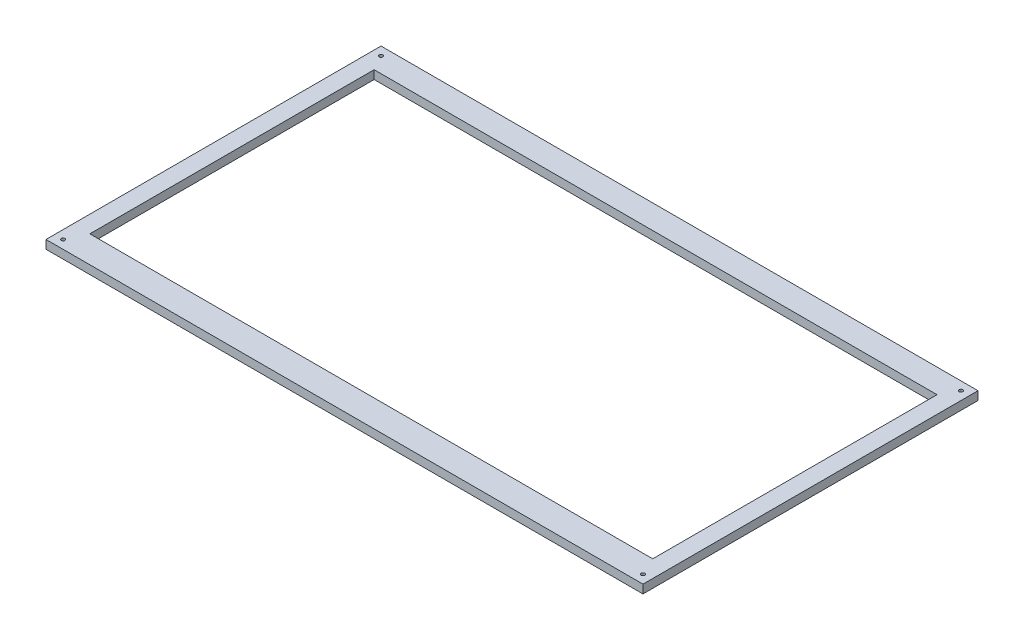
ISO-10303-21;
HEADER;
FILE_DESCRIPTION(('STEP AP214'),'2;1');
FILE_NAME('part.step','',(''),(''),'','','');
FILE_SCHEMA(('AUTOMOTIVE_DESIGN { 1 0 10303 214 1 1 1 1 }'));
ENDSEC;
DATA;
#1=APPLICATION_CONTEXT('core data for automotive mechanical design processes');
#2=APPLICATION_PROTOCOL_DEFINITION('international standard','automotive_design',2000,#1);
#3=PRODUCT_CONTEXT('',#1,'mechanical');
#4=PRODUCT('Part','Part','',(#3));
#5=PRODUCT_RELATED_PRODUCT_CATEGORY('part','',(#4));
#6=PRODUCT_DEFINITION_FORMATION('','',#4);
#7=PRODUCT_DEFINITION_CONTEXT('part definition',#1,'design');
#8=PRODUCT_DEFINITION('design','',#6,#7);
#9=PRODUCT_DEFINITION_SHAPE('','',#8);
#10=(LENGTH_UNIT() NAMED_UNIT(*) SI_UNIT(.MILLI.,.METRE.));
#11=(NAMED_UNIT(*) PLANE_ANGLE_UNIT() SI_UNIT($,.RADIAN.));
#12=(NAMED_UNIT(*) SI_UNIT($,.STERADIAN.) SOLID_ANGLE_UNIT());
#13=UNCERTAINTY_MEASURE_WITH_UNIT(LENGTH_MEASURE(1.E-05),#10,'distance_accuracy_value','');
#14=(GEOMETRIC_REPRESENTATION_CONTEXT(3) GLOBAL_UNCERTAINTY_ASSIGNED_CONTEXT((#13)) GLOBAL_UNIT_ASSIGNED_CONTEXT((#10,
#11,#12)) REPRESENTATION_CONTEXT('',''));
#15=CARTESIAN_POINT('',(0.,0.,0.));
#16=DIRECTION('',(0.,0.,1.));
#17=DIRECTION('',(1.,0.,0.));
#18=AXIS2_PLACEMENT_3D('',#15,#16,#17);
#19=CARTESIAN_POINT('',(-1050.,-30.,-589.25));
#20=DIRECTION('',(-1.,0.,0.));
#21=DIRECTION('',(0.,0.,1.));
#22=AXIS2_PLACEMENT_3D('',#19,#20,#21);
#23=PLANE('',#22);
#24=DIRECTION('',(0.,0.,1.));
#25=VECTOR('',#24,1.);
#26=CARTESIAN_POINT('',(-1050.,0.,-589.25));
#27=LINE('',#26,#25);
#28=CARTESIAN_POINT('',(-1050.,0.,-589.25));
#29=VERTEX_POINT('',#28);
#30=CARTESIAN_POINT('',(-1050.,0.,589.25));
#31=VERTEX_POINT('',#30);
#32=EDGE_CURVE('E136',#29,#31,#27,.T.);
#33=ORIENTED_EDGE('',*,*,#32,.F.);
#34=DIRECTION('',(0.,1.,0.));
#35=VECTOR('',#34,1.);
#36=CARTESIAN_POINT('',(-1050.,-30.,-589.25));
#37=LINE('',#36,#35);
#38=CARTESIAN_POINT('',(-1050.,-30.,-589.25));
#39=VERTEX_POINT('',#38);
#40=EDGE_CURVE('E11',#39,#29,#37,.T.);
#41=ORIENTED_EDGE('',*,*,#40,.F.);
#42=DIRECTION('',(0.,0.,1.));
#43=VECTOR('',#42,1.);
#44=CARTESIAN_POINT('',(-1050.,-30.,-589.25));
#45=LINE('',#44,#43);
#46=CARTESIAN_POINT('',(-1050.,-30.,589.25));
#47=VERTEX_POINT('',#46);
#48=EDGE_CURVE('E140',#39,#47,#45,.T.);
#49=ORIENTED_EDGE('',*,*,#48,.T.);
#50=DIRECTION('',(0.,1.,0.));
#51=VECTOR('',#50,1.);
#52=CARTESIAN_POINT('',(-1050.,-30.,589.25));
#53=LINE('',#52,#51);
#54=EDGE_CURVE('E37',#47,#31,#53,.T.);
#55=ORIENTED_EDGE('',*,*,#54,.T.);
#56=EDGE_LOOP('',(#33,#41,#49,#55));
#57=FACE_BOUND('',#56,.T.);
#58=ADVANCED_FACE('F34',(#57),#23,.T.);
#59=CARTESIAN_POINT('',(-1050.,-30.,-589.25));
#60=DIRECTION('',(0.,0.,-1.));
#61=DIRECTION('',(-1.,0.,0.));
#62=AXIS2_PLACEMENT_3D('',#59,#60,#61);
#63=PLANE('',#62);
#64=DIRECTION('',(-1.,0.,0.));
#65=VECTOR('',#64,1.);
#66=CARTESIAN_POINT('',(-1050.,0.,-589.25));
#67=LINE('',#66,#65);
#68=CARTESIAN_POINT('',(1050.,0.,-589.25));
#69=VERTEX_POINT('',#68);
#70=EDGE_CURVE('E144',#69,#29,#67,.T.);
#71=ORIENTED_EDGE('',*,*,#70,.F.);
#72=DIRECTION('',(0.,1.,0.));
#73=VECTOR('',#72,1.);
#74=CARTESIAN_POINT('',(1050.,-30.,-589.25));
#75=LINE('',#74,#73);
#76=CARTESIAN_POINT('',(1050.,-30.,-589.25));
#77=VERTEX_POINT('',#76);
#78=EDGE_CURVE('E42',#77,#69,#75,.T.);
#79=ORIENTED_EDGE('',*,*,#78,.F.);
#80=DIRECTION('',(-1.,0.,0.));
#81=VECTOR('',#80,1.);
#82=CARTESIAN_POINT('',(-1050.,-30.,-589.25));
#83=LINE('',#82,#81);
#84=EDGE_CURVE('E150',#77,#39,#83,.T.);
#85=ORIENTED_EDGE('',*,*,#84,.T.);
#86=ORIENTED_EDGE('',*,*,#40,.T.);
#87=EDGE_LOOP('',(#71,#79,#85,#86));
#88=FACE_BOUND('',#87,.T.);
#89=ADVANCED_FACE('F176',(#88),#63,.T.);
#90=CARTESIAN_POINT('',(1050.,-30.,-589.25));
#91=DIRECTION('',(1.,0.,0.));
#92=DIRECTION('',(0.,0.,-1.));
#93=AXIS2_PLACEMENT_3D('',#90,#91,#92);
#94=PLANE('',#93);
#95=DIRECTION('',(0.,0.,-1.));
#96=VECTOR('',#95,1.);
#97=CARTESIAN_POINT('',(1050.,0.,-589.25));
#98=LINE('',#97,#96);
#99=CARTESIAN_POINT('',(1050.,0.,589.25));
#100=VERTEX_POINT('',#99);
#101=EDGE_CURVE('E158',#100,#69,#98,.T.);
#102=ORIENTED_EDGE('',*,*,#101,.F.);
#103=DIRECTION('',(0.,1.,0.));
#104=VECTOR('',#103,1.);
#105=CARTESIAN_POINT('',(1050.,-30.,589.25));
#106=LINE('',#105,#104);
#107=CARTESIAN_POINT('',(1050.,-30.,589.25));
#108=VERTEX_POINT('',#107);
#109=EDGE_CURVE('E163',#108,#100,#106,.T.);
#110=ORIENTED_EDGE('',*,*,#109,.F.);
#111=DIRECTION('',(0.,0.,-1.));
#112=VECTOR('',#111,1.);
#113=CARTESIAN_POINT('',(1050.,-30.,-589.25));
#114=LINE('',#113,#112);
#115=EDGE_CURVE('E147',#108,#77,#114,.T.);
#116=ORIENTED_EDGE('',*,*,#115,.T.);
#117=ORIENTED_EDGE('',*,*,#78,.T.);
#118=EDGE_LOOP('',(#102,#110,#116,#117));
#119=FACE_BOUND('',#118,.T.);
#120=ADVANCED_FACE('F180',(#119),#94,.T.);
#121=CARTESIAN_POINT('',(-1050.,-30.,589.25));
#122=DIRECTION('',(0.,0.,1.));
#123=DIRECTION('',(1.,0.,0.));
#124=AXIS2_PLACEMENT_3D('',#121,#122,#123);
#125=PLANE('',#124);
#126=DIRECTION('',(1.,0.,0.));
#127=VECTOR('',#126,1.);
#128=CARTESIAN_POINT('',(-1050.,0.,589.25));
#129=LINE('',#128,#127);
#130=EDGE_CURVE('E155',#31,#100,#129,.T.);
#131=ORIENTED_EDGE('',*,*,#130,.F.);
#132=ORIENTED_EDGE('',*,*,#54,.F.);
#133=DIRECTION('',(1.,0.,0.));
#134=VECTOR('',#133,1.);
#135=CARTESIAN_POINT('',(-1050.,-30.,589.25));
#136=LINE('',#135,#134);
#137=EDGE_CURVE('E143',#47,#108,#136,.T.);
#138=ORIENTED_EDGE('',*,*,#137,.T.);
#139=ORIENTED_EDGE('',*,*,#109,.T.);
#140=EDGE_LOOP('',(#131,#132,#138,#139));
#141=FACE_BOUND('',#140,.T.);
#142=ADVANCED_FACE('F171',(#141),#125,.T.);
#143=CARTESIAN_POINT('',(0.,-30.,0.));
#144=DIRECTION('',(0.,1.,0.));
#145=DIRECTION('',(0.,0.,1.));
#146=AXIS2_PLACEMENT_3D('',#143,#144,#145);
#147=PLANE('',#146);
#148=CARTESIAN_POINT('',(-1020.,-30.,559.25));
#149=DIRECTION('',(0.,1.,0.));
#150=DIRECTION('',(0.,0.,1.));
#151=AXIS2_PLACEMENT_3D('',#148,#149,#150);
#152=CIRCLE('',#151,6.35000000000015);
#153=CARTESIAN_POINT('',(-1020.,-30.,565.6));
#154=VERTEX_POINT('',#153);
#155=EDGE_CURVE('E305',#154,#154,#152,.T.);
#156=ORIENTED_EDGE('',*,*,#155,.T.);
#157=EDGE_LOOP('',(#156));
#158=FACE_BOUND('',#157,.T.);
#159=CARTESIAN_POINT('',(1020.,-30.,-559.25));
#160=DIRECTION('',(0.,1.,0.));
#161=DIRECTION('',(0.,0.,1.));
#162=AXIS2_PLACEMENT_3D('',#159,#160,#161);
#163=CIRCLE('',#162,6.35000000000015);
#164=CARTESIAN_POINT('',(1020.,-30.,-552.9));
#165=VERTEX_POINT('',#164);
#166=EDGE_CURVE('E309',#165,#165,#163,.T.);
#167=ORIENTED_EDGE('',*,*,#166,.T.);
#168=EDGE_LOOP('',(#167));
#169=FACE_BOUND('',#168,.T.);
#170=CARTESIAN_POINT('',(1020.,-30.,559.25));
#171=DIRECTION('',(0.,1.,0.));
#172=DIRECTION('',(0.,0.,1.));
#173=AXIS2_PLACEMENT_3D('',#170,#171,#172);
#174=CIRCLE('',#173,6.35000000000015);
#175=CARTESIAN_POINT('',(1020.,-30.,565.6));
#176=VERTEX_POINT('',#175);
#177=EDGE_CURVE('E318',#176,#176,#174,.T.);
#178=ORIENTED_EDGE('',*,*,#177,.T.);
#179=EDGE_LOOP('',(#178));
#180=FACE_BOUND('',#179,.T.);
#181=CARTESIAN_POINT('',(-1020.,-30.,-559.25));
#182=DIRECTION('',(0.,1.,0.));
#183=DIRECTION('',(0.,0.,1.));
#184=AXIS2_PLACEMENT_3D('',#181,#182,#183);
#185=CIRCLE('',#184,6.35000000000015);
#186=CARTESIAN_POINT('',(-1020.,-30.,-552.9));
#187=VERTEX_POINT('',#186);
#188=EDGE_CURVE('E130',#187,#187,#185,.T.);
#189=ORIENTED_EDGE('',*,*,#188,.T.);
#190=EDGE_LOOP('',(#189));
#191=FACE_BOUND('',#190,.T.);
#192=DIRECTION('',(-1.,0.,0.));
#193=VECTOR('',#192,1.);
#194=CARTESIAN_POINT('',(-989.999999999992,-30.,-505.));
#195=LINE('',#194,#193);
#196=CARTESIAN_POINT('',(990.000000000008,-30.,-505.));
#197=VERTEX_POINT('',#196);
#198=CARTESIAN_POINT('',(-989.999999999992,-30.,-505.));
#199=VERTEX_POINT('',#198);
#200=EDGE_CURVE('E107',#197,#199,#195,.T.);
#201=ORIENTED_EDGE('',*,*,#200,.T.);
#202=DIRECTION('',(0.,0.,1.));
#203=VECTOR('',#202,1.);
#204=CARTESIAN_POINT('',(-989.999999999992,-30.,495.));
#205=LINE('',#204,#203);
#206=CARTESIAN_POINT('',(-989.999999999992,-30.,495.));
#207=VERTEX_POINT('',#206);
#208=EDGE_CURVE('E101',#199,#207,#205,.T.);
#209=ORIENTED_EDGE('',*,*,#208,.T.);
#210=DIRECTION('',(1.,0.,0.));
#211=VECTOR('',#210,1.);
#212=CARTESIAN_POINT('',(990.000000000009,-30.,495.));
#213=LINE('',#212,#211);
#214=CARTESIAN_POINT('',(990.000000000009,-30.,495.));
#215=VERTEX_POINT('',#214);
#216=EDGE_CURVE('E110',#207,#215,#213,.T.);
#217=ORIENTED_EDGE('',*,*,#216,.T.);
#218=DIRECTION('',(0.,0.,-1.));
#219=VECTOR('',#218,1.);
#220=CARTESIAN_POINT('',(990.000000000008,-30.,-505.));
#221=LINE('',#220,#219);
#222=EDGE_CURVE('E50',#215,#197,#221,.T.);
#223=ORIENTED_EDGE('',*,*,#222,.T.);
#224=EDGE_LOOP('',(#201,#209,#217,#223));
#225=FACE_BOUND('',#224,.T.);
#226=ORIENTED_EDGE('',*,*,#48,.F.);
#227=ORIENTED_EDGE('',*,*,#84,.F.);
#228=ORIENTED_EDGE('',*,*,#115,.F.);
#229=ORIENTED_EDGE('',*,*,#137,.F.);
#230=EDGE_LOOP('',(#226,#227,#228,#229));
#231=FACE_BOUND('',#230,.T.);
#232=ADVANCED_FACE('F114',(#158,#169,#180,#191,#225,#231),#147,.F.);
#233=CARTESIAN_POINT('',(0.,0.,0.));
#234=DIRECTION('',(0.,1.,0.));
#235=DIRECTION('',(0.,0.,1.));
#236=AXIS2_PLACEMENT_3D('',#233,#234,#235);
#237=PLANE('',#236);
#238=CARTESIAN_POINT('',(-1020.,0.,559.25));
#239=DIRECTION('',(0.,1.,0.));
#240=DIRECTION('',(0.,0.,1.));
#241=AXIS2_PLACEMENT_3D('',#238,#239,#240);
#242=CIRCLE('',#241,6.35000000000015);
#243=CARTESIAN_POINT('',(-1020.,0.,565.6));
#244=VERTEX_POINT('',#243);
#245=EDGE_CURVE('E308',#244,#244,#242,.T.);
#246=ORIENTED_EDGE('',*,*,#245,.F.);
#247=EDGE_LOOP('',(#246));
#248=FACE_BOUND('',#247,.T.);
#249=CARTESIAN_POINT('',(1020.,0.,-559.25));
#250=DIRECTION('',(0.,1.,0.));
#251=DIRECTION('',(0.,0.,1.));
#252=AXIS2_PLACEMENT_3D('',#249,#250,#251);
#253=CIRCLE('',#252,6.35000000000015);
#254=CARTESIAN_POINT('',(1020.,0.,-552.9));
#255=VERTEX_POINT('',#254);
#256=EDGE_CURVE('E313',#255,#255,#253,.T.);
#257=ORIENTED_EDGE('',*,*,#256,.F.);
#258=EDGE_LOOP('',(#257));
#259=FACE_BOUND('',#258,.T.);
#260=CARTESIAN_POINT('',(1020.,0.,559.25));
#261=DIRECTION('',(0.,1.,0.));
#262=DIRECTION('',(0.,0.,1.));
#263=AXIS2_PLACEMENT_3D('',#260,#261,#262);
#264=CIRCLE('',#263,6.35000000000015);
#265=CARTESIAN_POINT('',(1020.,0.,565.6));
#266=VERTEX_POINT('',#265);
#267=EDGE_CURVE('E332',#266,#266,#264,.T.);
#268=ORIENTED_EDGE('',*,*,#267,.F.);
#269=EDGE_LOOP('',(#268));
#270=FACE_BOUND('',#269,.T.);
#271=CARTESIAN_POINT('',(-1020.,0.,-559.25));
#272=DIRECTION('',(0.,1.,0.));
#273=DIRECTION('',(0.,0.,1.));
#274=AXIS2_PLACEMENT_3D('',#271,#272,#273);
#275=CIRCLE('',#274,6.35000000000015);
#276=CARTESIAN_POINT('',(-1020.,0.,-552.9));
#277=VERTEX_POINT('',#276);
#278=EDGE_CURVE('E123',#277,#277,#275,.T.);
#279=ORIENTED_EDGE('',*,*,#278,.F.);
#280=EDGE_LOOP('',(#279));
#281=FACE_BOUND('',#280,.T.);
#282=DIRECTION('',(0.,0.,1.));
#283=VECTOR('',#282,1.);
#284=CARTESIAN_POINT('',(-989.999999999992,0.,495.));
#285=LINE('',#284,#283);
#286=CARTESIAN_POINT('',(-989.999999999992,0.,-505.));
#287=VERTEX_POINT('',#286);
#288=CARTESIAN_POINT('',(-989.999999999992,0.,495.));
#289=VERTEX_POINT('',#288);
#290=EDGE_CURVE('E58',#287,#289,#285,.T.);
#291=ORIENTED_EDGE('',*,*,#290,.F.);
#292=DIRECTION('',(-1.,0.,0.));
#293=VECTOR('',#292,1.);
#294=CARTESIAN_POINT('',(-989.999999999992,0.,-505.));
#295=LINE('',#294,#293);
#296=CARTESIAN_POINT('',(990.000000000008,0.,-505.));
#297=VERTEX_POINT('',#296);
#298=EDGE_CURVE('E117',#297,#287,#295,.T.);
#299=ORIENTED_EDGE('',*,*,#298,.F.);
#300=DIRECTION('',(0.,0.,-1.));
#301=VECTOR('',#300,1.);
#302=CARTESIAN_POINT('',(990.000000000008,0.,-505.));
#303=LINE('',#302,#301);
#304=CARTESIAN_POINT('',(990.000000000009,0.,495.));
#305=VERTEX_POINT('',#304);
#306=EDGE_CURVE('E120',#305,#297,#303,.T.);
#307=ORIENTED_EDGE('',*,*,#306,.F.);
#308=DIRECTION('',(1.,0.,0.));
#309=VECTOR('',#308,1.);
#310=CARTESIAN_POINT('',(990.000000000009,0.,495.));
#311=LINE('',#310,#309);
#312=EDGE_CURVE('E129',#289,#305,#311,.T.);
#313=ORIENTED_EDGE('',*,*,#312,.F.);
#314=EDGE_LOOP('',(#291,#299,#307,#313));
#315=FACE_BOUND('',#314,.T.);
#316=ORIENTED_EDGE('',*,*,#32,.T.);
#317=ORIENTED_EDGE('',*,*,#130,.T.);
#318=ORIENTED_EDGE('',*,*,#101,.T.);
#319=ORIENTED_EDGE('',*,*,#70,.T.);
#320=EDGE_LOOP('',(#316,#317,#318,#319));
#321=FACE_BOUND('',#320,.T.);
#322=ADVANCED_FACE('F173',(#248,#259,#270,#281,#315,#321),#237,.T.);
#323=CARTESIAN_POINT('',(-989.999999999992,-30.,495.));
#324=DIRECTION('',(-1.,0.,0.));
#325=DIRECTION('',(0.,0.,1.));
#326=AXIS2_PLACEMENT_3D('',#323,#324,#325);
#327=PLANE('',#326);
#328=ORIENTED_EDGE('',*,*,#290,.T.);
#329=DIRECTION('',(0.,1.,0.));
#330=VECTOR('',#329,1.);
#331=CARTESIAN_POINT('',(-989.999999999992,-30.,495.));
#332=LINE('',#331,#330);
#333=EDGE_CURVE('E97',#207,#289,#332,.T.);
#334=ORIENTED_EDGE('',*,*,#333,.F.);
#335=ORIENTED_EDGE('',*,*,#208,.F.);
#336=DIRECTION('',(0.,1.,0.));
#337=VECTOR('',#336,1.);
#338=CARTESIAN_POINT('',(-989.999999999992,-30.,-505.));
#339=LINE('',#338,#337);
#340=EDGE_CURVE('E134',#199,#287,#339,.T.);
#341=ORIENTED_EDGE('',*,*,#340,.T.);
#342=EDGE_LOOP('',(#328,#334,#335,#341));
#343=FACE_BOUND('',#342,.T.);
#344=ADVANCED_FACE('F99',(#343),#327,.F.);
#345=CARTESIAN_POINT('',(-989.999999999992,-30.,-505.));
#346=DIRECTION('',(0.,0.,-1.));
#347=DIRECTION('',(-1.,0.,0.));
#348=AXIS2_PLACEMENT_3D('',#345,#346,#347);
#349=PLANE('',#348);
#350=ORIENTED_EDGE('',*,*,#298,.T.);
#351=ORIENTED_EDGE('',*,*,#340,.F.);
#352=ORIENTED_EDGE('',*,*,#200,.F.);
#353=DIRECTION('',(0.,1.,0.));
#354=VECTOR('',#353,1.);
#355=CARTESIAN_POINT('',(990.000000000008,-30.,-505.));
#356=LINE('',#355,#354);
#357=EDGE_CURVE('E137',#197,#297,#356,.T.);
#358=ORIENTED_EDGE('',*,*,#357,.T.);
#359=EDGE_LOOP('',(#350,#351,#352,#358));
#360=FACE_BOUND('',#359,.T.);
#361=ADVANCED_FACE('F216',(#360),#349,.F.);
#362=CARTESIAN_POINT('',(990.000000000008,-30.,-505.));
#363=DIRECTION('',(1.,0.,0.));
#364=DIRECTION('',(0.,0.,-1.));
#365=AXIS2_PLACEMENT_3D('',#362,#363,#364);
#366=PLANE('',#365);
#367=ORIENTED_EDGE('',*,*,#306,.T.);
#368=ORIENTED_EDGE('',*,*,#357,.F.);
#369=ORIENTED_EDGE('',*,*,#222,.F.);
#370=DIRECTION('',(0.,1.,0.));
#371=VECTOR('',#370,1.);
#372=CARTESIAN_POINT('',(990.000000000009,-30.,495.));
#373=LINE('',#372,#371);
#374=EDGE_CURVE('E106',#215,#305,#373,.T.);
#375=ORIENTED_EDGE('',*,*,#374,.T.);
#376=EDGE_LOOP('',(#367,#368,#369,#375));
#377=FACE_BOUND('',#376,.T.);
#378=ADVANCED_FACE('F227',(#377),#366,.F.);
#379=CARTESIAN_POINT('',(990.000000000009,-30.,495.));
#380=DIRECTION('',(0.,0.,1.));
#381=DIRECTION('',(1.,0.,0.));
#382=AXIS2_PLACEMENT_3D('',#379,#380,#381);
#383=PLANE('',#382);
#384=ORIENTED_EDGE('',*,*,#312,.T.);
#385=ORIENTED_EDGE('',*,*,#374,.F.);
#386=ORIENTED_EDGE('',*,*,#216,.F.);
#387=ORIENTED_EDGE('',*,*,#333,.T.);
#388=EDGE_LOOP('',(#384,#385,#386,#387));
#389=FACE_BOUND('',#388,.T.);
#390=ADVANCED_FACE('F111',(#389),#383,.F.);
#391=CARTESIAN_POINT('',(-1020.,-30.,-559.25));
#392=DIRECTION('',(0.,1.,0.));
#393=DIRECTION('',(0.,0.,1.));
#394=AXIS2_PLACEMENT_3D('',#391,#392,#393);
#395=CYLINDRICAL_SURFACE('',#394,6.35000000000015);
#396=ORIENTED_EDGE('',*,*,#188,.F.);
#397=EDGE_LOOP('',(#396));
#398=FACE_BOUND('',#397,.T.);
#399=ORIENTED_EDGE('',*,*,#278,.T.);
#400=EDGE_LOOP('',(#399));
#401=FACE_BOUND('',#400,.T.);
#402=ADVANCED_FACE('F245',(#398,#401),#395,.F.);
#403=CARTESIAN_POINT('',(1020.,-30.,559.25));
#404=DIRECTION('',(0.,1.,0.));
#405=DIRECTION('',(0.,0.,1.));
#406=AXIS2_PLACEMENT_3D('',#403,#404,#405);
#407=CYLINDRICAL_SURFACE('',#406,6.35000000000015);
#408=ORIENTED_EDGE('',*,*,#177,.F.);
#409=EDGE_LOOP('',(#408));
#410=FACE_BOUND('',#409,.T.);
#411=ORIENTED_EDGE('',*,*,#267,.T.);
#412=EDGE_LOOP('',(#411));
#413=FACE_BOUND('',#412,.T.);
#414=ADVANCED_FACE('F268',(#410,#413),#407,.F.);
#415=CARTESIAN_POINT('',(1020.,-30.,-559.25));
#416=DIRECTION('',(0.,1.,0.));
#417=DIRECTION('',(0.,0.,1.));
#418=AXIS2_PLACEMENT_3D('',#415,#416,#417);
#419=CYLINDRICAL_SURFACE('',#418,6.35000000000015);
#420=ORIENTED_EDGE('',*,*,#166,.F.);
#421=EDGE_LOOP('',(#420));
#422=FACE_BOUND('',#421,.T.);
#423=ORIENTED_EDGE('',*,*,#256,.T.);
#424=EDGE_LOOP('',(#423));
#425=FACE_BOUND('',#424,.T.);
#426=ADVANCED_FACE('F278',(#422,#425),#419,.F.);
#427=CARTESIAN_POINT('',(-1020.,-30.,559.25));
#428=DIRECTION('',(0.,1.,0.));
#429=DIRECTION('',(0.,0.,1.));
#430=AXIS2_PLACEMENT_3D('',#427,#428,#429);
#431=CYLINDRICAL_SURFACE('',#430,6.35000000000015);
#432=ORIENTED_EDGE('',*,*,#155,.F.);
#433=EDGE_LOOP('',(#432));
#434=FACE_BOUND('',#433,.T.);
#435=ORIENTED_EDGE('',*,*,#245,.T.);
#436=EDGE_LOOP('',(#435));
#437=FACE_BOUND('',#436,.T.);
#438=ADVANCED_FACE('F288',(#434,#437),#431,.F.);
#439=CLOSED_SHELL('',(#58,#89,#120,#142,#232,#322,#344,#361,#378,#390,#402,#414,#426,#438));
#440=MANIFOLD_SOLID_BREP('B2',#439);
#441=ADVANCED_BREP_SHAPE_REPRESENTATION('',(#18,#440),#14);
#442=SHAPE_DEFINITION_REPRESENTATION(#9,#441);
ENDSEC;
END-ISO-10303-21;
